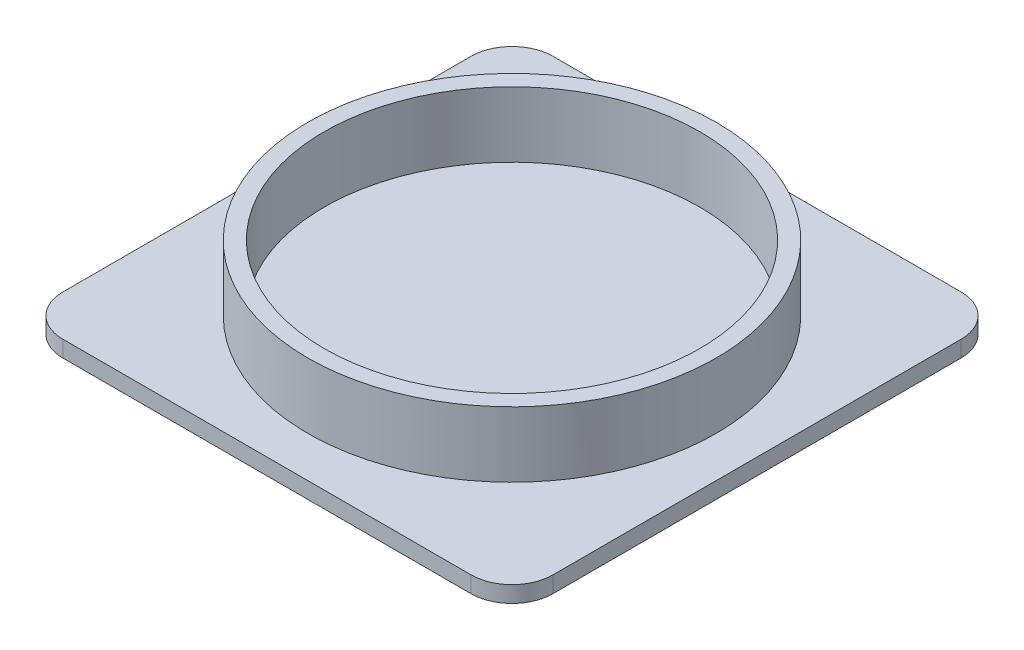
ISO-10303-21;
HEADER;
FILE_DESCRIPTION(('STEP AP214'),'2;1');
FILE_NAME('part.step','',(''),(''),'','','');
FILE_SCHEMA(('AUTOMOTIVE_DESIGN { 1 0 10303 214 1 1 1 1 }'));
ENDSEC;
DATA;
#1=APPLICATION_CONTEXT('core data for automotive mechanical design processes');
#2=APPLICATION_PROTOCOL_DEFINITION('international standard','automotive_design',2000,#1);
#3=PRODUCT_CONTEXT('',#1,'mechanical');
#4=PRODUCT('Part','Part','',(#3));
#5=PRODUCT_RELATED_PRODUCT_CATEGORY('part','',(#4));
#6=PRODUCT_DEFINITION_FORMATION('','',#4);
#7=PRODUCT_DEFINITION_CONTEXT('part definition',#1,'design');
#8=PRODUCT_DEFINITION('design','',#6,#7);
#9=PRODUCT_DEFINITION_SHAPE('','',#8);
#10=(LENGTH_UNIT() NAMED_UNIT(*) SI_UNIT(.MILLI.,.METRE.));
#11=(NAMED_UNIT(*) PLANE_ANGLE_UNIT() SI_UNIT($,.RADIAN.));
#12=(NAMED_UNIT(*) SI_UNIT($,.STERADIAN.) SOLID_ANGLE_UNIT());
#13=UNCERTAINTY_MEASURE_WITH_UNIT(LENGTH_MEASURE(1.E-05),#10,'distance_accuracy_value','');
#14=(GEOMETRIC_REPRESENTATION_CONTEXT(3) GLOBAL_UNCERTAINTY_ASSIGNED_CONTEXT((#13)) GLOBAL_UNIT_ASSIGNED_CONTEXT((#10,
#11,#12)) REPRESENTATION_CONTEXT('',''));
#15=CARTESIAN_POINT('',(0.,0.,0.));
#16=DIRECTION('',(0.,0.,1.));
#17=DIRECTION('',(1.,0.,0.));
#18=AXIS2_PLACEMENT_3D('',#15,#16,#17);
#19=CARTESIAN_POINT('',(0.,12.7,0.));
#20=DIRECTION('',(0.,-1.,0.));
#21=DIRECTION('',(0.,0.,-1.));
#22=AXIS2_PLACEMENT_3D('',#19,#20,#21);
#23=CYLINDRICAL_SURFACE('',#22,31.75);
#24=CARTESIAN_POINT('',(0.,12.7,0.));
#25=DIRECTION('',(0.,1.,0.));
#26=DIRECTION('',(0.,0.,1.));
#27=AXIS2_PLACEMENT_3D('',#24,#25,#26);
#28=CIRCLE('',#27,31.75);
#29=CARTESIAN_POINT('',(0.,12.7,31.75));
#30=VERTEX_POINT('',#29);
#31=EDGE_CURVE('E137',#30,#30,#28,.T.);
#32=ORIENTED_EDGE('',*,*,#31,.F.);
#33=EDGE_LOOP('',(#32));
#34=FACE_BOUND('',#33,.T.);
#35=CARTESIAN_POINT('',(0.,2.53999999999999,0.));
#36=DIRECTION('',(0.,-1.,0.));
#37=DIRECTION('',(0.,0.,-1.));
#38=AXIS2_PLACEMENT_3D('',#35,#36,#37);
#39=CIRCLE('',#38,31.75);
#40=CARTESIAN_POINT('',(0.,2.53999999999999,-31.75));
#41=VERTEX_POINT('',#40);
#42=EDGE_CURVE('E134',#41,#41,#39,.T.);
#43=ORIENTED_EDGE('',*,*,#42,.F.);
#44=EDGE_LOOP('',(#43));
#45=FACE_BOUND('',#44,.T.);
#46=ADVANCED_FACE('F34',(#34,#45),#23,.T.);
#47=CARTESIAN_POINT('',(0.,12.7,0.));
#48=DIRECTION('',(0.,-1.,0.));
#49=DIRECTION('',(0.,0.,-1.));
#50=AXIS2_PLACEMENT_3D('',#47,#48,#49);
#51=CYLINDRICAL_SURFACE('',#50,29.21);
#52=CARTESIAN_POINT('',(0.,12.7,0.));
#53=DIRECTION('',(0.,1.,0.));
#54=DIRECTION('',(0.,0.,1.));
#55=AXIS2_PLACEMENT_3D('',#52,#53,#54);
#56=CIRCLE('',#55,29.21);
#57=CARTESIAN_POINT('',(0.,12.7,29.21));
#58=VERTEX_POINT('',#57);
#59=EDGE_CURVE('E138',#58,#58,#56,.T.);
#60=ORIENTED_EDGE('',*,*,#59,.T.);
#61=EDGE_LOOP('',(#60));
#62=FACE_BOUND('',#61,.T.);
#63=CARTESIAN_POINT('',(0.,2.53999999999999,0.));
#64=DIRECTION('',(0.,-1.,0.));
#65=DIRECTION('',(0.,0.,-1.));
#66=AXIS2_PLACEMENT_3D('',#63,#64,#65);
#67=CIRCLE('',#66,29.21);
#68=CARTESIAN_POINT('',(0.,2.53999999999999,-29.21));
#69=VERTEX_POINT('',#68);
#70=EDGE_CURVE('E141',#69,#69,#67,.T.);
#71=ORIENTED_EDGE('',*,*,#70,.T.);
#72=EDGE_LOOP('',(#71));
#73=FACE_BOUND('',#72,.T.);
#74=ADVANCED_FACE('F199',(#62,#73),#51,.F.);
#75=CARTESIAN_POINT('',(0.,12.7,0.));
#76=DIRECTION('',(0.,1.,0.));
#77=DIRECTION('',(0.,0.,1.));
#78=AXIS2_PLACEMENT_3D('',#75,#76,#77);
#79=PLANE('',#78);
#80=ORIENTED_EDGE('',*,*,#31,.T.);
#81=EDGE_LOOP('',(#80));
#82=FACE_BOUND('',#81,.T.);
#83=ORIENTED_EDGE('',*,*,#59,.F.);
#84=EDGE_LOOP('',(#83));
#85=FACE_BOUND('',#84,.T.);
#86=ADVANCED_FACE('F205',(#82,#85),#79,.T.);
#87=CARTESIAN_POINT('',(0.,2.53999999999999,0.));
#88=DIRECTION('',(0.,-1.,0.));
#89=DIRECTION('',(0.,0.,-1.));
#90=AXIS2_PLACEMENT_3D('',#87,#88,#89);
#91=PLANE('',#90);
#92=ORIENTED_EDGE('',*,*,#70,.F.);
#93=EDGE_LOOP('',(#92));
#94=FACE_BOUND('',#93,.T.);
#95=ADVANCED_FACE('F242',(#94),#91,.F.);
#96=CARTESIAN_POINT('',(38.1,2.53999999999999,38.1));
#97=DIRECTION('',(-1.,0.,0.));
#98=DIRECTION('',(0.,0.,1.));
#99=AXIS2_PLACEMENT_3D('',#96,#97,#98);
#100=PLANE('',#99);
#101=DIRECTION('',(0.,0.,-1.));
#102=VECTOR('',#101,1.);
#103=CARTESIAN_POINT('',(38.1,0.,38.1));
#104=LINE('',#103,#102);
#105=CARTESIAN_POINT('',(38.1,0.,31.75));
#106=VERTEX_POINT('',#105);
#107=CARTESIAN_POINT('',(38.1,0.,-31.75));
#108=VERTEX_POINT('',#107);
#109=EDGE_CURVE('E130',#106,#108,#104,.T.);
#110=ORIENTED_EDGE('',*,*,#109,.T.);
#111=DIRECTION('',(0.,-1.,0.));
#112=VECTOR('',#111,1.);
#113=CARTESIAN_POINT('',(38.1,2.53999999999999,-31.7500000000001));
#114=LINE('',#113,#112);
#115=CARTESIAN_POINT('',(38.1,2.53999999999999,-31.75));
#116=VERTEX_POINT('',#115);
#117=EDGE_CURVE('E11',#108,#116,#114,.F.);
#118=ORIENTED_EDGE('',*,*,#117,.T.);
#119=DIRECTION('',(0.,0.,-1.));
#120=VECTOR('',#119,1.);
#121=CARTESIAN_POINT('',(38.1,2.53999999999999,38.1));
#122=LINE('',#121,#120);
#123=CARTESIAN_POINT('',(38.1,2.53999999999999,31.75));
#124=VERTEX_POINT('',#123);
#125=EDGE_CURVE('E128',#124,#116,#122,.T.);
#126=ORIENTED_EDGE('',*,*,#125,.F.);
#127=DIRECTION('',(0.,-1.,0.));
#128=VECTOR('',#127,1.);
#129=CARTESIAN_POINT('',(38.1,2.53999999999999,31.75));
#130=LINE('',#129,#128);
#131=EDGE_CURVE('E42',#124,#106,#130,.T.);
#132=ORIENTED_EDGE('',*,*,#131,.T.);
#133=EDGE_LOOP('',(#110,#118,#126,#132));
#134=FACE_BOUND('',#133,.T.);
#135=ADVANCED_FACE('F171',(#134),#100,.F.);
#136=CARTESIAN_POINT('',(-38.1,2.53999999999999,-38.1000000000001));
#137=DIRECTION('',(0.,0.,1.));
#138=DIRECTION('',(1.,0.,0.));
#139=AXIS2_PLACEMENT_3D('',#136,#137,#138);
#140=PLANE('',#139);
#141=DIRECTION('',(-1.,0.,0.));
#142=VECTOR('',#141,1.);
#143=CARTESIAN_POINT('',(-38.1,0.,-38.1000000000001));
#144=LINE('',#143,#142);
#145=CARTESIAN_POINT('',(31.75,0.,-38.1000000000001));
#146=VERTEX_POINT('',#145);
#147=CARTESIAN_POINT('',(-31.75,0.,-38.1000000000001));
#148=VERTEX_POINT('',#147);
#149=EDGE_CURVE('E126',#146,#148,#144,.T.);
#150=ORIENTED_EDGE('',*,*,#149,.T.);
#151=DIRECTION('',(0.,-1.,0.));
#152=VECTOR('',#151,1.);
#153=CARTESIAN_POINT('',(-31.75,2.53999999999999,-38.1000000000001));
#154=LINE('',#153,#152);
#155=CARTESIAN_POINT('',(-31.75,2.53999999999999,-38.1000000000001));
#156=VERTEX_POINT('',#155);
#157=EDGE_CURVE('E105',#148,#156,#154,.F.);
#158=ORIENTED_EDGE('',*,*,#157,.T.);
#159=DIRECTION('',(-1.,0.,0.));
#160=VECTOR('',#159,1.);
#161=CARTESIAN_POINT('',(-38.1,2.53999999999999,-38.1000000000001));
#162=LINE('',#161,#160);
#163=CARTESIAN_POINT('',(31.75,2.53999999999999,-38.1000000000001));
#164=VERTEX_POINT('',#163);
#165=EDGE_CURVE('E179',#164,#156,#162,.T.);
#166=ORIENTED_EDGE('',*,*,#165,.F.);
#167=DIRECTION('',(0.,-1.,0.));
#168=VECTOR('',#167,1.);
#169=CARTESIAN_POINT('',(31.75,2.53999999999999,-38.1000000000001));
#170=LINE('',#169,#168);
#171=EDGE_CURVE('E110',#164,#146,#170,.T.);
#172=ORIENTED_EDGE('',*,*,#171,.T.);
#173=EDGE_LOOP('',(#150,#158,#166,#172));
#174=FACE_BOUND('',#173,.T.);
#175=ADVANCED_FACE('F189',(#174),#140,.F.);
#176=CARTESIAN_POINT('',(-38.1,2.53999999999999,38.1));
#177=DIRECTION('',(1.,0.,0.));
#178=DIRECTION('',(0.,0.,-1.));
#179=AXIS2_PLACEMENT_3D('',#176,#177,#178);
#180=PLANE('',#179);
#181=DIRECTION('',(0.,0.,1.));
#182=VECTOR('',#181,1.);
#183=CARTESIAN_POINT('',(-38.1,2.53999999999999,38.1));
#184=LINE('',#183,#182);
#185=CARTESIAN_POINT('',(-38.1,2.53999999999999,-31.75));
#186=VERTEX_POINT('',#185);
#187=CARTESIAN_POINT('',(-38.1,2.53999999999999,31.75));
#188=VERTEX_POINT('',#187);
#189=EDGE_CURVE('E119',#186,#188,#184,.T.);
#190=ORIENTED_EDGE('',*,*,#189,.F.);
#191=DIRECTION('',(0.,-1.,0.));
#192=VECTOR('',#191,1.);
#193=CARTESIAN_POINT('',(-38.1,2.53999999999999,-31.7500000000001));
#194=LINE('',#193,#192);
#195=CARTESIAN_POINT('',(-38.1,0.,-31.75));
#196=VERTEX_POINT('',#195);
#197=EDGE_CURVE('E104',#186,#196,#194,.T.);
#198=ORIENTED_EDGE('',*,*,#197,.T.);
#199=DIRECTION('',(0.,0.,1.));
#200=VECTOR('',#199,1.);
#201=CARTESIAN_POINT('',(-38.1,0.,38.1));
#202=LINE('',#201,#200);
#203=CARTESIAN_POINT('',(-38.1,0.,31.75));
#204=VERTEX_POINT('',#203);
#205=EDGE_CURVE('E117',#196,#204,#202,.T.);
#206=ORIENTED_EDGE('',*,*,#205,.T.);
#207=DIRECTION('',(0.,-1.,0.));
#208=VECTOR('',#207,1.);
#209=CARTESIAN_POINT('',(-38.1,2.53999999999999,31.75));
#210=LINE('',#209,#208);
#211=EDGE_CURVE('E121',#204,#188,#210,.F.);
#212=ORIENTED_EDGE('',*,*,#211,.T.);
#213=EDGE_LOOP('',(#190,#198,#206,#212));
#214=FACE_BOUND('',#213,.T.);
#215=ADVANCED_FACE('F116',(#214),#180,.F.);
#216=CARTESIAN_POINT('',(-38.1,2.53999999999999,38.1));
#217=DIRECTION('',(0.,0.,-1.));
#218=DIRECTION('',(-1.,0.,0.));
#219=AXIS2_PLACEMENT_3D('',#216,#217,#218);
#220=PLANE('',#219);
#221=DIRECTION('',(1.,0.,0.));
#222=VECTOR('',#221,1.);
#223=CARTESIAN_POINT('',(-38.1,2.53999999999999,38.1));
#224=LINE('',#223,#222);
#225=CARTESIAN_POINT('',(-31.75,2.53999999999999,38.1));
#226=VERTEX_POINT('',#225);
#227=CARTESIAN_POINT('',(31.75,2.53999999999999,38.1));
#228=VERTEX_POINT('',#227);
#229=EDGE_CURVE('E146',#226,#228,#224,.T.);
#230=ORIENTED_EDGE('',*,*,#229,.F.);
#231=DIRECTION('',(0.,-1.,0.));
#232=VECTOR('',#231,1.);
#233=CARTESIAN_POINT('',(-31.75,2.53999999999999,38.1));
#234=LINE('',#233,#232);
#235=CARTESIAN_POINT('',(-31.75,0.,38.1));
#236=VERTEX_POINT('',#235);
#237=EDGE_CURVE('E163',#226,#236,#234,.T.);
#238=ORIENTED_EDGE('',*,*,#237,.T.);
#239=DIRECTION('',(1.,0.,0.));
#240=VECTOR('',#239,1.);
#241=CARTESIAN_POINT('',(-38.1,0.,38.1));
#242=LINE('',#241,#240);
#243=CARTESIAN_POINT('',(31.75,0.,38.1));
#244=VERTEX_POINT('',#243);
#245=EDGE_CURVE('E125',#236,#244,#242,.T.);
#246=ORIENTED_EDGE('',*,*,#245,.T.);
#247=DIRECTION('',(0.,-1.,0.));
#248=VECTOR('',#247,1.);
#249=CARTESIAN_POINT('',(31.75,2.53999999999999,38.1));
#250=LINE('',#249,#248);
#251=EDGE_CURVE('E49',#244,#228,#250,.F.);
#252=ORIENTED_EDGE('',*,*,#251,.T.);
#253=EDGE_LOOP('',(#230,#238,#246,#252));
#254=FACE_BOUND('',#253,.T.);
#255=ADVANCED_FACE('F193',(#254),#220,.F.);
#256=ORIENTED_EDGE('',*,*,#42,.T.);
#257=EDGE_LOOP('',(#256));
#258=FACE_BOUND('',#257,.T.);
#259=ORIENTED_EDGE('',*,*,#165,.T.);
#260=CARTESIAN_POINT('',(-31.75,2.53999999999999,-31.7500000000001));
#261=DIRECTION('',(0.,-1.,0.));
#262=DIRECTION('',(0.,0.,-1.));
#263=AXIS2_PLACEMENT_3D('',#260,#261,#262);
#264=CIRCLE('',#263,6.35);
#265=EDGE_CURVE('E160',#156,#186,#264,.F.);
#266=ORIENTED_EDGE('',*,*,#265,.T.);
#267=ORIENTED_EDGE('',*,*,#189,.T.);
#268=CARTESIAN_POINT('',(-31.75,2.53999999999999,31.75));
#269=DIRECTION('',(0.,-1.,0.));
#270=DIRECTION('',(0.,0.,-1.));
#271=AXIS2_PLACEMENT_3D('',#268,#269,#270);
#272=CIRCLE('',#271,6.35);
#273=EDGE_CURVE('E56',#188,#226,#272,.F.);
#274=ORIENTED_EDGE('',*,*,#273,.T.);
#275=ORIENTED_EDGE('',*,*,#229,.T.);
#276=CARTESIAN_POINT('',(31.75,2.53999999999999,31.75));
#277=DIRECTION('',(0.,-1.,0.));
#278=DIRECTION('',(0.,0.,-1.));
#279=AXIS2_PLACEMENT_3D('',#276,#277,#278);
#280=CIRCLE('',#279,6.35);
#281=EDGE_CURVE('E155',#228,#124,#280,.F.);
#282=ORIENTED_EDGE('',*,*,#281,.T.);
#283=ORIENTED_EDGE('',*,*,#125,.T.);
#284=CARTESIAN_POINT('',(31.75,2.53999999999999,-31.7500000000001));
#285=DIRECTION('',(0.,-1.,0.));
#286=DIRECTION('',(0.,0.,-1.));
#287=AXIS2_PLACEMENT_3D('',#284,#285,#286);
#288=CIRCLE('',#287,6.35);
#289=EDGE_CURVE('E157',#116,#164,#288,.F.);
#290=ORIENTED_EDGE('',*,*,#289,.T.);
#291=EDGE_LOOP('',(#259,#266,#267,#274,#275,#282,#283,#290));
#292=FACE_BOUND('',#291,.T.);
#293=ADVANCED_FACE('F183',(#258,#292),#91,.F.);
#294=CARTESIAN_POINT('',(0.,0.,0.));
#295=DIRECTION('',(0.,1.,0.));
#296=DIRECTION('',(0.,0.,1.));
#297=AXIS2_PLACEMENT_3D('',#294,#295,#296);
#298=PLANE('',#297);
#299=ORIENTED_EDGE('',*,*,#205,.F.);
#300=CARTESIAN_POINT('',(-31.75,0.,-31.7500000000001));
#301=DIRECTION('',(0.,1.,0.));
#302=DIRECTION('',(0.,0.,1.));
#303=AXIS2_PLACEMENT_3D('',#300,#301,#302);
#304=CIRCLE('',#303,6.35);
#305=EDGE_CURVE('E100',#196,#148,#304,.F.);
#306=ORIENTED_EDGE('',*,*,#305,.T.);
#307=ORIENTED_EDGE('',*,*,#149,.F.);
#308=CARTESIAN_POINT('',(31.75,0.,-31.7500000000001));
#309=DIRECTION('',(0.,1.,0.));
#310=DIRECTION('',(0.,0.,1.));
#311=AXIS2_PLACEMENT_3D('',#308,#309,#310);
#312=CIRCLE('',#311,6.35);
#313=EDGE_CURVE('E149',#146,#108,#312,.F.);
#314=ORIENTED_EDGE('',*,*,#313,.T.);
#315=ORIENTED_EDGE('',*,*,#109,.F.);
#316=CARTESIAN_POINT('',(31.75,0.,31.75));
#317=DIRECTION('',(0.,1.,0.));
#318=DIRECTION('',(0.,0.,1.));
#319=AXIS2_PLACEMENT_3D('',#316,#317,#318);
#320=CIRCLE('',#319,6.35);
#321=EDGE_CURVE('E120',#106,#244,#320,.F.);
#322=ORIENTED_EDGE('',*,*,#321,.T.);
#323=ORIENTED_EDGE('',*,*,#245,.F.);
#324=CARTESIAN_POINT('',(-31.75,0.,31.75));
#325=DIRECTION('',(0.,1.,0.));
#326=DIRECTION('',(0.,0.,1.));
#327=AXIS2_PLACEMENT_3D('',#324,#325,#326);
#328=CIRCLE('',#327,6.35);
#329=EDGE_CURVE('E111',#236,#204,#328,.F.);
#330=ORIENTED_EDGE('',*,*,#329,.T.);
#331=EDGE_LOOP('',(#299,#306,#307,#314,#315,#322,#323,#330));
#332=FACE_BOUND('',#331,.T.);
#333=ADVANCED_FACE('F123',(#332),#298,.F.);
#334=CARTESIAN_POINT('',(-31.75,2.53999999999999,-31.7500000000001));
#335=DIRECTION('',(0.,-1.,0.));
#336=DIRECTION('',(0.,0.,-1.));
#337=AXIS2_PLACEMENT_3D('',#334,#335,#336);
#338=CYLINDRICAL_SURFACE('',#337,6.35);
#339=ORIENTED_EDGE('',*,*,#265,.F.);
#340=ORIENTED_EDGE('',*,*,#157,.F.);
#341=ORIENTED_EDGE('',*,*,#305,.F.);
#342=ORIENTED_EDGE('',*,*,#197,.F.);
#343=EDGE_LOOP('',(#339,#340,#341,#342));
#344=FACE_BOUND('',#343,.T.);
#345=ADVANCED_FACE('F103',(#344),#338,.T.);
#346=CARTESIAN_POINT('',(-31.75,2.53999999999999,31.75));
#347=DIRECTION('',(0.,-1.,0.));
#348=DIRECTION('',(0.,0.,-1.));
#349=AXIS2_PLACEMENT_3D('',#346,#347,#348);
#350=CYLINDRICAL_SURFACE('',#349,6.35);
#351=ORIENTED_EDGE('',*,*,#273,.F.);
#352=ORIENTED_EDGE('',*,*,#211,.F.);
#353=ORIENTED_EDGE('',*,*,#329,.F.);
#354=ORIENTED_EDGE('',*,*,#237,.F.);
#355=EDGE_LOOP('',(#351,#352,#353,#354));
#356=FACE_BOUND('',#355,.T.);
#357=ADVANCED_FACE('F192',(#356),#350,.T.);
#358=CARTESIAN_POINT('',(31.75,2.53999999999999,-31.7500000000001));
#359=DIRECTION('',(0.,-1.,0.));
#360=DIRECTION('',(0.,0.,-1.));
#361=AXIS2_PLACEMENT_3D('',#358,#359,#360);
#362=CYLINDRICAL_SURFACE('',#361,6.35);
#363=ORIENTED_EDGE('',*,*,#289,.F.);
#364=ORIENTED_EDGE('',*,*,#117,.F.);
#365=ORIENTED_EDGE('',*,*,#313,.F.);
#366=ORIENTED_EDGE('',*,*,#171,.F.);
#367=EDGE_LOOP('',(#363,#364,#365,#366));
#368=FACE_BOUND('',#367,.T.);
#369=ADVANCED_FACE('F187',(#368),#362,.T.);
#370=CARTESIAN_POINT('',(31.75,2.53999999999999,31.75));
#371=DIRECTION('',(0.,-1.,0.));
#372=DIRECTION('',(0.,0.,-1.));
#373=AXIS2_PLACEMENT_3D('',#370,#371,#372);
#374=CYLINDRICAL_SURFACE('',#373,6.35);
#375=ORIENTED_EDGE('',*,*,#281,.F.);
#376=ORIENTED_EDGE('',*,*,#251,.F.);
#377=ORIENTED_EDGE('',*,*,#321,.F.);
#378=ORIENTED_EDGE('',*,*,#131,.F.);
#379=EDGE_LOOP('',(#375,#376,#377,#378));
#380=FACE_BOUND('',#379,.T.);
#381=ADVANCED_FACE('F36',(#380),#374,.T.);
#382=CLOSED_SHELL('',(#46,#74,#86,#95,#135,#175,#215,#255,#293,#333,#345,#357,#369,#381));
#383=MANIFOLD_SOLID_BREP('B2',#382);
#384=ADVANCED_BREP_SHAPE_REPRESENTATION('',(#18,#383),#14);
#385=SHAPE_DEFINITION_REPRESENTATION(#9,#384);
ENDSEC;
END-ISO-10303-21;
